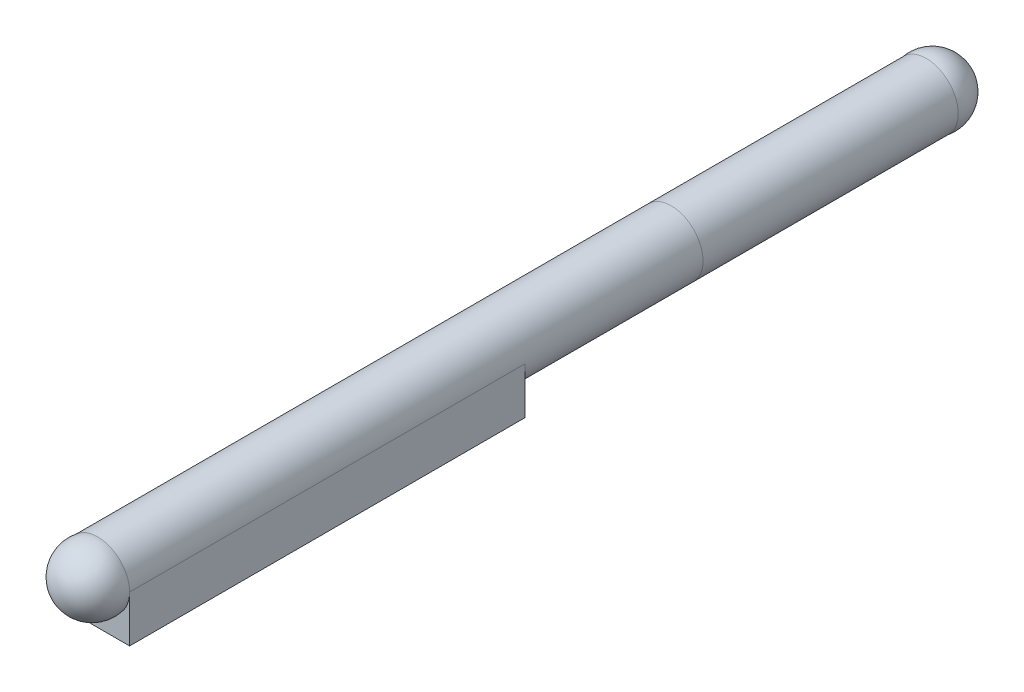
ISO-10303-21;
HEADER;
FILE_DESCRIPTION(('STEP AP214'),'2;1');
FILE_NAME('part.step','',(''),(''),'','','');
FILE_SCHEMA(('AUTOMOTIVE_DESIGN { 1 0 10303 214 1 1 1 1 }'));
ENDSEC;
DATA;
#1=APPLICATION_CONTEXT('core data for automotive mechanical design processes');
#2=APPLICATION_PROTOCOL_DEFINITION('international standard','automotive_design',2000,#1);
#3=PRODUCT_CONTEXT('',#1,'mechanical');
#4=PRODUCT('Part','Part','',(#3));
#5=PRODUCT_RELATED_PRODUCT_CATEGORY('part','',(#4));
#6=PRODUCT_DEFINITION_FORMATION('','',#4);
#7=PRODUCT_DEFINITION_CONTEXT('part definition',#1,'design');
#8=PRODUCT_DEFINITION('design','',#6,#7);
#9=PRODUCT_DEFINITION_SHAPE('','',#8);
#10=(LENGTH_UNIT() NAMED_UNIT(*) SI_UNIT(.MILLI.,.METRE.));
#11=(NAMED_UNIT(*) PLANE_ANGLE_UNIT() SI_UNIT($,.RADIAN.));
#12=(NAMED_UNIT(*) SI_UNIT($,.STERADIAN.) SOLID_ANGLE_UNIT());
#13=UNCERTAINTY_MEASURE_WITH_UNIT(LENGTH_MEASURE(1.E-05),#10,'distance_accuracy_value','');
#14=(GEOMETRIC_REPRESENTATION_CONTEXT(3) GLOBAL_UNCERTAINTY_ASSIGNED_CONTEXT((#13)) GLOBAL_UNIT_ASSIGNED_CONTEXT((#10,
#11,#12)) REPRESENTATION_CONTEXT('',''));
#15=CARTESIAN_POINT('',(0.,0.,0.));
#16=DIRECTION('',(0.,0.,1.));
#17=DIRECTION('',(1.,0.,0.));
#18=AXIS2_PLACEMENT_3D('',#15,#16,#17);
#19=CARTESIAN_POINT('',(0.,4.,-20.));
#20=DIRECTION('',(0.,0.,1.));
#21=DIRECTION('',(1.,0.,0.));
#22=AXIS2_PLACEMENT_3D('',#19,#20,#21);
#23=CYLINDRICAL_SURFACE('',#22,2.5);
#24=CARTESIAN_POINT('',(0.,4.,-20.));
#25=DIRECTION('',(0.,0.,1.));
#26=DIRECTION('',(1.,0.,0.));
#27=AXIS2_PLACEMENT_3D('',#24,#25,#26);
#28=CIRCLE('',#27,2.5);
#29=CARTESIAN_POINT('',(2.5,4.,-20.));
#30=VERTEX_POINT('',#29);
#31=EDGE_CURVE('E49',#30,#30,#28,.T.);
#32=ORIENTED_EDGE('',*,*,#31,.T.);
#33=EDGE_LOOP('',(#32));
#34=FACE_BOUND('',#33,.T.);
#35=CARTESIAN_POINT('',(0.,4.,0.));
#36=DIRECTION('',(0.,0.,-1.));
#37=DIRECTION('',(1.,0.,0.));
#38=AXIS2_PLACEMENT_3D('',#35,#36,#37);
#39=CIRCLE('',#38,2.5);
#40=CARTESIAN_POINT('',(2.5,4.,0.));
#41=VERTEX_POINT('',#40);
#42=EDGE_CURVE('E11',#41,#41,#39,.T.);
#43=ORIENTED_EDGE('',*,*,#42,.T.);
#44=EDGE_LOOP('',(#43));
#45=FACE_BOUND('',#44,.T.);
#46=ADVANCED_FACE('F41',(#34,#45),#23,.T.);
#47=ORIENTED_EDGE('',*,*,#42,.F.);
#48=EDGE_LOOP('',(#47));
#49=FACE_BOUND('',#48,.T.);
#50=CARTESIAN_POINT('',(0.,4.,44.9399999999999));
#51=DIRECTION('',(0.,0.,-1.));
#52=DIRECTION('',(0.,1.,0.));
#53=AXIS2_PLACEMENT_3D('',#50,#51,#52);
#54=CIRCLE('',#53,2.5);
#55=CARTESIAN_POINT('',(-2.5,4.,44.9399999999999));
#56=VERTEX_POINT('',#55);
#57=CARTESIAN_POINT('',(2.5,4.,44.9399999999999));
#58=VERTEX_POINT('',#57);
#59=EDGE_CURVE('E80',#56,#58,#54,.T.);
#60=ORIENTED_EDGE('',*,*,#59,.T.);
#61=DIRECTION('',(0.,0.,1.));
#62=VECTOR('',#61,1.);
#63=CARTESIAN_POINT('',(2.5,4.,-20.));
#64=LINE('',#63,#62);
#65=CARTESIAN_POINT('',(2.5,4.,13.9399999999999));
#66=VERTEX_POINT('',#65);
#67=EDGE_CURVE('E61',#66,#58,#64,.T.);
#68=ORIENTED_EDGE('',*,*,#67,.F.);
#69=CARTESIAN_POINT('',(0.,4.,13.9399999999999));
#70=DIRECTION('',(0.,0.,1.));
#71=DIRECTION('',(0.,-1.,0.));
#72=AXIS2_PLACEMENT_3D('',#69,#70,#71);
#73=CIRCLE('',#72,2.5);
#74=CARTESIAN_POINT('',(-2.5,4.,13.9399999999999));
#75=VERTEX_POINT('',#74);
#76=EDGE_CURVE('E56',#75,#66,#73,.T.);
#77=ORIENTED_EDGE('',*,*,#76,.F.);
#78=DIRECTION('',(0.,0.,1.));
#79=VECTOR('',#78,1.);
#80=CARTESIAN_POINT('',(-2.5,4.,-20.));
#81=LINE('',#80,#79);
#82=EDGE_CURVE('E85',#75,#56,#81,.T.);
#83=ORIENTED_EDGE('',*,*,#82,.T.);
#84=EDGE_LOOP('',(#60,#68,#77,#83));
#85=FACE_BOUND('',#84,.T.);
#86=ADVANCED_FACE('F89',(#49,#85),#23,.T.);
#87=CARTESIAN_POINT('',(0.,4.,-20.4583333333333));
#88=DIRECTION('',(0.,0.,1.));
#89=DIRECTION('',(1.,0.,0.));
#90=AXIS2_PLACEMENT_3D('',#87,#88,#89);
#91=SPHERICAL_SURFACE('',#90,2.54166666666667);
#92=ORIENTED_EDGE('',*,*,#31,.F.);
#93=EDGE_LOOP('',(#92));
#94=FACE_BOUND('',#93,.T.);
#95=ADVANCED_FACE('F43',(#94),#91,.T.);
#96=CARTESIAN_POINT('',(0.,4.,45.3983333333332));
#97=DIRECTION('',(0.,0.,1.));
#98=DIRECTION('',(1.,0.,0.));
#99=AXIS2_PLACEMENT_3D('',#96,#97,#98);
#100=SPHERICAL_SURFACE('',#99,2.54166666666667);
#101=EDGE_CURVE('E83',#58,#56,#54,.T.);
#102=ORIENTED_EDGE('',*,*,#101,.F.);
#103=ORIENTED_EDGE('',*,*,#59,.F.);
#104=EDGE_LOOP('',(#102,#103));
#105=FACE_BOUND('',#104,.T.);
#106=ADVANCED_FACE('F81',(#105),#100,.T.);
#107=CARTESIAN_POINT('',(-2.5,0.339999999999998,13.9399999999999));
#108=DIRECTION('',(0.,1.,0.));
#109=DIRECTION('',(0.,0.,1.));
#110=AXIS2_PLACEMENT_3D('',#107,#108,#109);
#111=PLANE('',#110);
#112=DIRECTION('',(-1.,0.,0.));
#113=VECTOR('',#112,1.);
#114=CARTESIAN_POINT('',(2.5,0.339999999999998,13.9399999999999));
#115=LINE('',#114,#113);
#116=CARTESIAN_POINT('',(2.5,0.339999999999998,13.9399999999999));
#117=VERTEX_POINT('',#116);
#118=CARTESIAN_POINT('',(-2.5,0.339999999999998,13.9399999999999));
#119=VERTEX_POINT('',#118);
#120=EDGE_CURVE('E91',#117,#119,#115,.T.);
#121=ORIENTED_EDGE('',*,*,#120,.F.);
#122=DIRECTION('',(0.,0.,-1.));
#123=VECTOR('',#122,1.);
#124=CARTESIAN_POINT('',(2.5,0.339999999999999,44.9399999999999));
#125=LINE('',#124,#123);
#126=CARTESIAN_POINT('',(2.5,0.339999999999999,44.9399999999999));
#127=VERTEX_POINT('',#126);
#128=EDGE_CURVE('E102',#127,#117,#125,.T.);
#129=ORIENTED_EDGE('',*,*,#128,.F.);
#130=DIRECTION('',(1.,0.,0.));
#131=VECTOR('',#130,1.);
#132=CARTESIAN_POINT('',(-2.5,0.339999999999999,44.9399999999999));
#133=LINE('',#132,#131);
#134=CARTESIAN_POINT('',(-2.5,0.339999999999999,44.9399999999999));
#135=VERTEX_POINT('',#134);
#136=EDGE_CURVE('E101',#135,#127,#133,.T.);
#137=ORIENTED_EDGE('',*,*,#136,.F.);
#138=DIRECTION('',(0.,0.,1.));
#139=VECTOR('',#138,1.);
#140=CARTESIAN_POINT('',(-2.5,0.339999999999998,13.9399999999999));
#141=LINE('',#140,#139);
#142=EDGE_CURVE('E97',#119,#135,#141,.T.);
#143=ORIENTED_EDGE('',*,*,#142,.F.);
#144=EDGE_LOOP('',(#121,#129,#137,#143));
#145=FACE_BOUND('',#144,.T.);
#146=ADVANCED_FACE('F126',(#145),#111,.F.);
#147=CARTESIAN_POINT('',(2.5,6.54266666666667,44.9399999999999));
#148=DIRECTION('',(-1.,0.,0.));
#149=DIRECTION('',(0.,0.,1.));
#150=AXIS2_PLACEMENT_3D('',#147,#148,#149);
#151=PLANE('',#150);
#152=DIRECTION('',(0.,-1.,0.));
#153=VECTOR('',#152,1.);
#154=CARTESIAN_POINT('',(2.5,6.54266666666667,13.9399999999999));
#155=LINE('',#154,#153);
#156=EDGE_CURVE('E112',#66,#117,#155,.T.);
#157=ORIENTED_EDGE('',*,*,#156,.F.);
#158=ORIENTED_EDGE('',*,*,#67,.T.);
#159=DIRECTION('',(0.,-1.,0.));
#160=VECTOR('',#159,1.);
#161=CARTESIAN_POINT('',(2.5,6.54266666666667,44.9399999999999));
#162=LINE('',#161,#160);
#163=EDGE_CURVE('E105',#58,#127,#162,.T.);
#164=ORIENTED_EDGE('',*,*,#163,.T.);
#165=ORIENTED_EDGE('',*,*,#128,.T.);
#166=EDGE_LOOP('',(#157,#158,#164,#165));
#167=FACE_BOUND('',#166,.T.);
#168=ADVANCED_FACE('F124',(#167),#151,.F.);
#169=CARTESIAN_POINT('',(-2.5,6.54266666666667,44.9399999999999));
#170=DIRECTION('',(0.,0.,-1.));
#171=DIRECTION('',(0.,1.,0.));
#172=AXIS2_PLACEMENT_3D('',#169,#170,#171);
#173=PLANE('',#172);
#174=ORIENTED_EDGE('',*,*,#163,.F.);
#175=ORIENTED_EDGE('',*,*,#101,.T.);
#176=DIRECTION('',(0.,-1.,0.));
#177=VECTOR('',#176,1.);
#178=CARTESIAN_POINT('',(-2.5,6.54266666666667,44.9399999999999));
#179=LINE('',#178,#177);
#180=EDGE_CURVE('E94',#56,#135,#179,.T.);
#181=ORIENTED_EDGE('',*,*,#180,.T.);
#182=ORIENTED_EDGE('',*,*,#136,.T.);
#183=EDGE_LOOP('',(#174,#175,#181,#182));
#184=FACE_BOUND('',#183,.T.);
#185=ADVANCED_FACE('F104',(#184),#173,.F.);
#186=CARTESIAN_POINT('',(-2.5,6.54266666666667,13.9399999999999));
#187=DIRECTION('',(1.,0.,0.));
#188=DIRECTION('',(0.,0.,-1.));
#189=AXIS2_PLACEMENT_3D('',#186,#187,#188);
#190=PLANE('',#189);
#191=ORIENTED_EDGE('',*,*,#82,.F.);
#192=DIRECTION('',(0.,-1.,0.));
#193=VECTOR('',#192,1.);
#194=CARTESIAN_POINT('',(-2.5,6.54266666666667,13.9399999999999));
#195=LINE('',#194,#193);
#196=EDGE_CURVE('E109',#75,#119,#195,.T.);
#197=ORIENTED_EDGE('',*,*,#196,.T.);
#198=ORIENTED_EDGE('',*,*,#142,.T.);
#199=ORIENTED_EDGE('',*,*,#180,.F.);
#200=EDGE_LOOP('',(#191,#197,#198,#199));
#201=FACE_BOUND('',#200,.T.);
#202=ADVANCED_FACE('F95',(#201),#190,.F.);
#203=CARTESIAN_POINT('',(2.5,6.54266666666667,13.9399999999999));
#204=DIRECTION('',(0.,0.,1.));
#205=DIRECTION('',(0.,-1.,0.));
#206=AXIS2_PLACEMENT_3D('',#203,#204,#205);
#207=PLANE('',#206);
#208=ORIENTED_EDGE('',*,*,#196,.F.);
#209=ORIENTED_EDGE('',*,*,#76,.T.);
#210=ORIENTED_EDGE('',*,*,#156,.T.);
#211=ORIENTED_EDGE('',*,*,#120,.T.);
#212=EDGE_LOOP('',(#208,#209,#210,#211));
#213=FACE_BOUND('',#212,.T.);
#214=ADVANCED_FACE('F128',(#213),#207,.F.);
#215=CLOSED_SHELL('',(#46,#86,#95,#106,#146,#168,#185,#202,#214));
#216=MANIFOLD_SOLID_BREP('B2',#215);
#217=ADVANCED_BREP_SHAPE_REPRESENTATION('',(#18,#216),#14);
#218=SHAPE_DEFINITION_REPRESENTATION(#9,#217);
ENDSEC;
END-ISO-10303-21;
